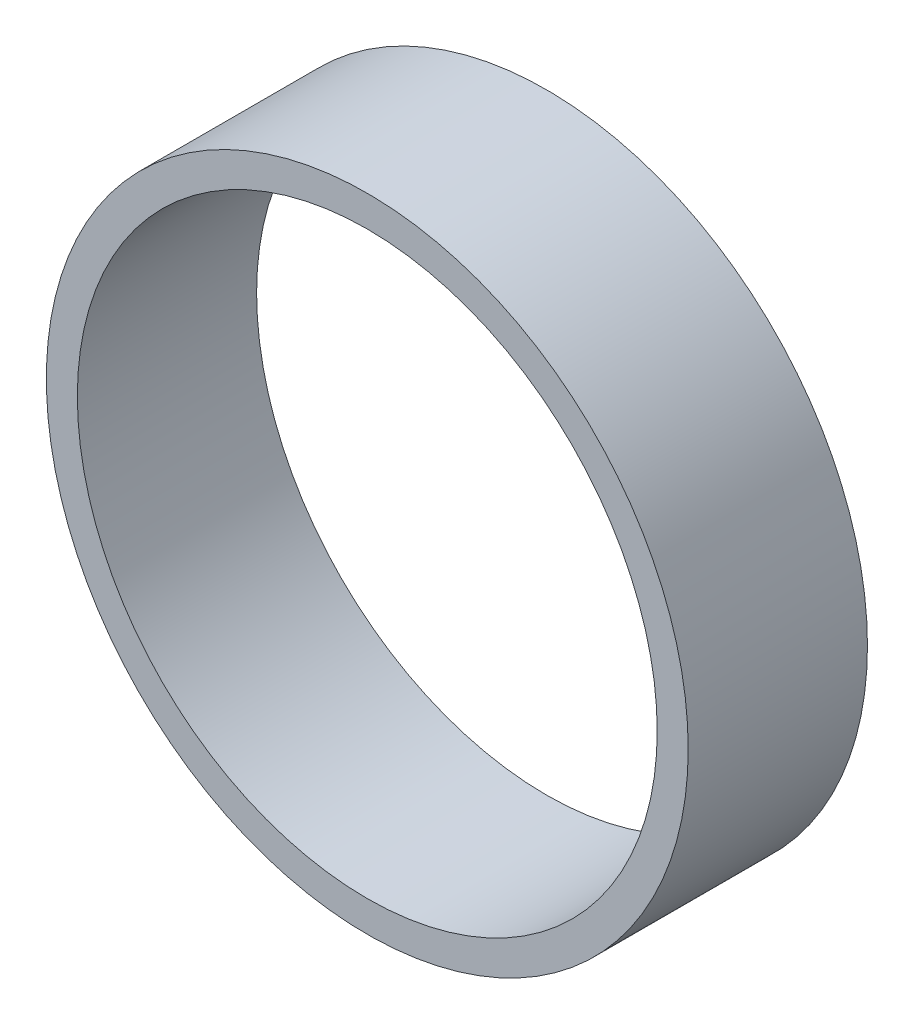
ISO-10303-21;
HEADER;
FILE_DESCRIPTION(('STEP AP214'),'2;1');
FILE_NAME('part.step','',(''),(''),'','','');
FILE_SCHEMA(('AUTOMOTIVE_DESIGN { 1 0 10303 214 1 1 1 1 }'));
ENDSEC;
DATA;
#1=APPLICATION_CONTEXT('core data for automotive mechanical design processes');
#2=APPLICATION_PROTOCOL_DEFINITION('international standard','automotive_design',2000,#1);
#3=PRODUCT_CONTEXT('',#1,'mechanical');
#4=PRODUCT('Part','Part','',(#3));
#5=PRODUCT_RELATED_PRODUCT_CATEGORY('part','',(#4));
#6=PRODUCT_DEFINITION_FORMATION('','',#4);
#7=PRODUCT_DEFINITION_CONTEXT('part definition',#1,'design');
#8=PRODUCT_DEFINITION('design','',#6,#7);
#9=PRODUCT_DEFINITION_SHAPE('','',#8);
#10=(LENGTH_UNIT() NAMED_UNIT(*) SI_UNIT(.MILLI.,.METRE.));
#11=(NAMED_UNIT(*) PLANE_ANGLE_UNIT() SI_UNIT($,.RADIAN.));
#12=(NAMED_UNIT(*) SI_UNIT($,.STERADIAN.) SOLID_ANGLE_UNIT());
#13=UNCERTAINTY_MEASURE_WITH_UNIT(LENGTH_MEASURE(1.E-05),#10,'distance_accuracy_value','');
#14=(GEOMETRIC_REPRESENTATION_CONTEXT(3) GLOBAL_UNCERTAINTY_ASSIGNED_CONTEXT((#13)) GLOBAL_UNIT_ASSIGNED_CONTEXT((#10,
#11,#12)) REPRESENTATION_CONTEXT('',''));
#15=CARTESIAN_POINT('',(0.,0.,0.));
#16=DIRECTION('',(0.,0.,1.));
#17=DIRECTION('',(1.,0.,0.));
#18=AXIS2_PLACEMENT_3D('',#15,#16,#17);
#19=CARTESIAN_POINT('',(0.,0.,22.9));
#20=DIRECTION('',(0.,0.,1.));
#21=DIRECTION('',(1.,0.,0.));
#22=AXIS2_PLACEMENT_3D('',#19,#20,#21);
#23=PLANE('',#22);
#24=CARTESIAN_POINT('',(0.,0.,22.9));
#25=DIRECTION('',(0.,0.,1.));
#26=DIRECTION('',(1.,0.,0.));
#27=AXIS2_PLACEMENT_3D('',#24,#25,#26);
#28=CIRCLE('',#27,41.);
#29=CARTESIAN_POINT('',(41.,0.,22.9));
#30=VERTEX_POINT('',#29);
#31=EDGE_CURVE('E10',#30,#30,#28,.T.);
#32=ORIENTED_EDGE('',*,*,#31,.T.);
#33=EDGE_LOOP('',(#32));
#34=FACE_BOUND('',#33,.T.);
#35=CARTESIAN_POINT('',(0.,0.,22.9));
#36=DIRECTION('',(0.,0.,1.));
#37=DIRECTION('',(1.,0.,0.));
#38=AXIS2_PLACEMENT_3D('',#35,#36,#37);
#39=CIRCLE('',#38,37.0406664730827);
#40=CARTESIAN_POINT('',(37.0406664730827,0.,22.9));
#41=VERTEX_POINT('',#40);
#42=EDGE_CURVE('E48',#41,#41,#39,.T.);
#43=ORIENTED_EDGE('',*,*,#42,.F.);
#44=EDGE_LOOP('',(#43));
#45=FACE_BOUND('',#44,.T.);
#46=ADVANCED_FACE('F37',(#34,#45),#23,.T.);
#47=CARTESIAN_POINT('',(0.,0.,0.));
#48=DIRECTION('',(0.,0.,1.));
#49=DIRECTION('',(1.,0.,0.));
#50=AXIS2_PLACEMENT_3D('',#47,#48,#49);
#51=PLANE('',#50);
#52=CARTESIAN_POINT('',(0.,0.,0.));
#53=DIRECTION('',(0.,0.,1.));
#54=DIRECTION('',(1.,0.,0.));
#55=AXIS2_PLACEMENT_3D('',#52,#53,#54);
#56=CIRCLE('',#55,41.);
#57=CARTESIAN_POINT('',(41.,0.,0.));
#58=VERTEX_POINT('',#57);
#59=EDGE_CURVE('E41',#58,#58,#56,.T.);
#60=ORIENTED_EDGE('',*,*,#59,.F.);
#61=EDGE_LOOP('',(#60));
#62=FACE_BOUND('',#61,.T.);
#63=CARTESIAN_POINT('',(0.,0.,0.));
#64=DIRECTION('',(0.,0.,1.));
#65=DIRECTION('',(1.,0.,0.));
#66=AXIS2_PLACEMENT_3D('',#63,#64,#65);
#67=CIRCLE('',#66,37.0406664730827);
#68=CARTESIAN_POINT('',(37.0406664730827,0.,0.));
#69=VERTEX_POINT('',#68);
#70=EDGE_CURVE('E50',#69,#69,#67,.T.);
#71=ORIENTED_EDGE('',*,*,#70,.T.);
#72=EDGE_LOOP('',(#71));
#73=FACE_BOUND('',#72,.T.);
#74=ADVANCED_FACE('F60',(#62,#73),#51,.F.);
#75=CARTESIAN_POINT('',(0.,0.,22.9));
#76=DIRECTION('',(0.,0.,-1.));
#77=DIRECTION('',(-1.,0.,0.));
#78=AXIS2_PLACEMENT_3D('',#75,#76,#77);
#79=CYLINDRICAL_SURFACE('',#78,41.);
#80=ORIENTED_EDGE('',*,*,#31,.F.);
#81=EDGE_LOOP('',(#80));
#82=FACE_BOUND('',#81,.T.);
#83=ORIENTED_EDGE('',*,*,#59,.T.);
#84=EDGE_LOOP('',(#83));
#85=FACE_BOUND('',#84,.T.);
#86=ADVANCED_FACE('F39',(#82,#85),#79,.T.);
#87=CARTESIAN_POINT('',(0.,0.,22.9));
#88=DIRECTION('',(0.,0.,-1.));
#89=DIRECTION('',(-1.,0.,0.));
#90=AXIS2_PLACEMENT_3D('',#87,#88,#89);
#91=CYLINDRICAL_SURFACE('',#90,37.0406664730827);
#92=ORIENTED_EDGE('',*,*,#42,.T.);
#93=EDGE_LOOP('',(#92));
#94=FACE_BOUND('',#93,.T.);
#95=ORIENTED_EDGE('',*,*,#70,.F.);
#96=EDGE_LOOP('',(#95));
#97=FACE_BOUND('',#96,.T.);
#98=ADVANCED_FACE('F56',(#94,#97),#91,.F.);
#99=CLOSED_SHELL('',(#46,#74,#86,#98));
#100=MANIFOLD_SOLID_BREP('B2',#99);
#101=ADVANCED_BREP_SHAPE_REPRESENTATION('',(#18,#100),#14);
#102=SHAPE_DEFINITION_REPRESENTATION(#9,#101);
ENDSEC;
END-ISO-10303-21;
